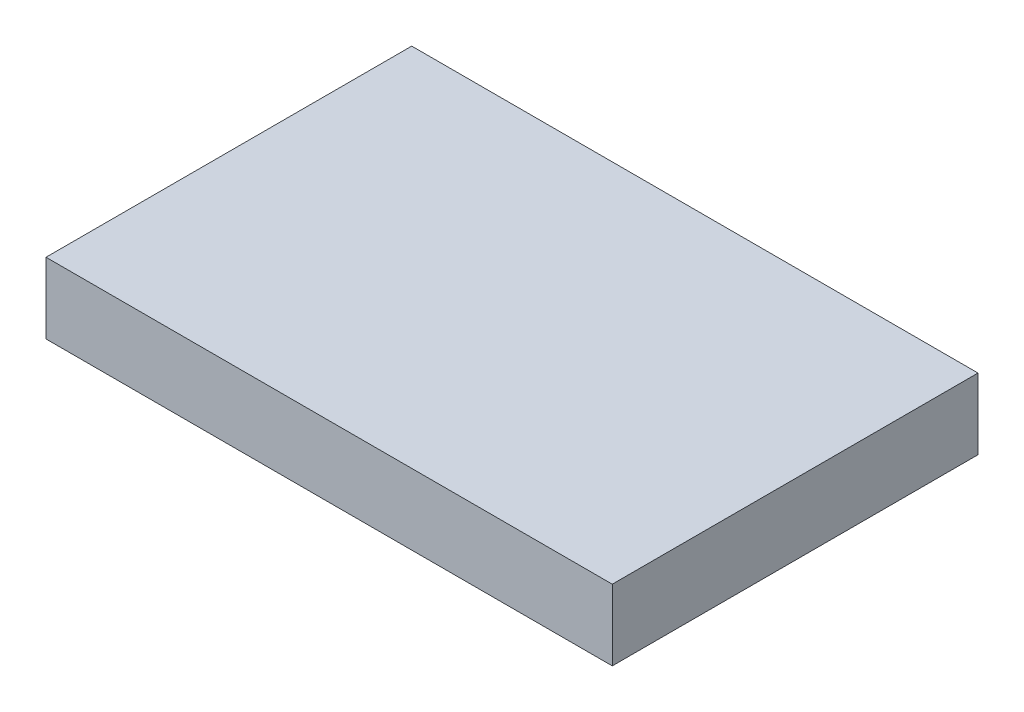
ISO-10303-21;
HEADER;
FILE_DESCRIPTION(('STEP AP214'),'2;1');
FILE_NAME('part.step','',(''),(''),'','','');
FILE_SCHEMA(('AUTOMOTIVE_DESIGN { 1 0 10303 214 1 1 1 1 }'));
ENDSEC;
DATA;
#1=APPLICATION_CONTEXT('core data for automotive mechanical design processes');
#2=APPLICATION_PROTOCOL_DEFINITION('international standard','automotive_design',2000,#1);
#3=PRODUCT_CONTEXT('',#1,'mechanical');
#4=PRODUCT('Part','Part','',(#3));
#5=PRODUCT_RELATED_PRODUCT_CATEGORY('part','',(#4));
#6=PRODUCT_DEFINITION_FORMATION('','',#4);
#7=PRODUCT_DEFINITION_CONTEXT('part definition',#1,'design');
#8=PRODUCT_DEFINITION('design','',#6,#7);
#9=PRODUCT_DEFINITION_SHAPE('','',#8);
#10=(LENGTH_UNIT() NAMED_UNIT(*) SI_UNIT(.MILLI.,.METRE.));
#11=(NAMED_UNIT(*) PLANE_ANGLE_UNIT() SI_UNIT($,.RADIAN.));
#12=(NAMED_UNIT(*) SI_UNIT($,.STERADIAN.) SOLID_ANGLE_UNIT());
#13=UNCERTAINTY_MEASURE_WITH_UNIT(LENGTH_MEASURE(1.E-05),#10,'distance_accuracy_value','');
#14=(GEOMETRIC_REPRESENTATION_CONTEXT(3) GLOBAL_UNCERTAINTY_ASSIGNED_CONTEXT((#13)) GLOBAL_UNIT_ASSIGNED_CONTEXT((#10,
#11,#12)) REPRESENTATION_CONTEXT('',''));
#15=CARTESIAN_POINT('',(0.,0.,0.));
#16=DIRECTION('',(0.,0.,1.));
#17=DIRECTION('',(1.,0.,0.));
#18=AXIS2_PLACEMENT_3D('',#15,#16,#17);
#19=CARTESIAN_POINT('',(24.,6.,15.5));
#20=DIRECTION('',(-1.,0.,0.));
#21=DIRECTION('',(0.,0.,1.));
#22=AXIS2_PLACEMENT_3D('',#19,#20,#21);
#23=PLANE('',#22);
#24=DIRECTION('',(0.,0.,-1.));
#25=VECTOR('',#24,1.);
#26=CARTESIAN_POINT('',(24.,0.,15.5));
#27=LINE('',#26,#25);
#28=CARTESIAN_POINT('',(24.,0.,15.5));
#29=VERTEX_POINT('',#28);
#30=CARTESIAN_POINT('',(24.,0.,-15.5));
#31=VERTEX_POINT('',#30);
#32=EDGE_CURVE('E96',#29,#31,#27,.T.);
#33=ORIENTED_EDGE('',*,*,#32,.T.);
#34=DIRECTION('',(0.,-1.,0.));
#35=VECTOR('',#34,1.);
#36=CARTESIAN_POINT('',(24.,6.,-15.5));
#37=LINE('',#36,#35);
#38=CARTESIAN_POINT('',(24.,6.,-15.5));
#39=VERTEX_POINT('',#38);
#40=EDGE_CURVE('E11',#39,#31,#37,.T.);
#41=ORIENTED_EDGE('',*,*,#40,.F.);
#42=DIRECTION('',(0.,0.,-1.));
#43=VECTOR('',#42,1.);
#44=CARTESIAN_POINT('',(24.,6.,15.5));
#45=LINE('',#44,#43);
#46=CARTESIAN_POINT('',(24.,6.,15.5));
#47=VERTEX_POINT('',#46);
#48=EDGE_CURVE('E84',#47,#39,#45,.T.);
#49=ORIENTED_EDGE('',*,*,#48,.F.);
#50=DIRECTION('',(0.,-1.,0.));
#51=VECTOR('',#50,1.);
#52=CARTESIAN_POINT('',(24.,6.,15.5));
#53=LINE('',#52,#51);
#54=EDGE_CURVE('E92',#47,#29,#53,.T.);
#55=ORIENTED_EDGE('',*,*,#54,.T.);
#56=EDGE_LOOP('',(#33,#41,#49,#55));
#57=FACE_BOUND('',#56,.T.);
#58=ADVANCED_FACE('F33',(#57),#23,.F.);
#59=CARTESIAN_POINT('',(-24.,6.,-15.5));
#60=DIRECTION('',(0.,0.,1.));
#61=DIRECTION('',(1.,0.,0.));
#62=AXIS2_PLACEMENT_3D('',#59,#60,#61);
#63=PLANE('',#62);
#64=DIRECTION('',(-1.,0.,0.));
#65=VECTOR('',#64,1.);
#66=CARTESIAN_POINT('',(-24.,0.,-15.5));
#67=LINE('',#66,#65);
#68=CARTESIAN_POINT('',(-24.,0.,-15.5));
#69=VERTEX_POINT('',#68);
#70=EDGE_CURVE('E88',#31,#69,#67,.T.);
#71=ORIENTED_EDGE('',*,*,#70,.T.);
#72=DIRECTION('',(0.,-1.,0.));
#73=VECTOR('',#72,1.);
#74=CARTESIAN_POINT('',(-24.,6.,-15.5));
#75=LINE('',#74,#73);
#76=CARTESIAN_POINT('',(-24.,6.,-15.5));
#77=VERTEX_POINT('',#76);
#78=EDGE_CURVE('E41',#77,#69,#75,.T.);
#79=ORIENTED_EDGE('',*,*,#78,.F.);
#80=DIRECTION('',(-1.,0.,0.));
#81=VECTOR('',#80,1.);
#82=CARTESIAN_POINT('',(-24.,6.,-15.5));
#83=LINE('',#82,#81);
#84=EDGE_CURVE('E79',#39,#77,#83,.T.);
#85=ORIENTED_EDGE('',*,*,#84,.F.);
#86=ORIENTED_EDGE('',*,*,#40,.T.);
#87=EDGE_LOOP('',(#71,#79,#85,#86));
#88=FACE_BOUND('',#87,.T.);
#89=ADVANCED_FACE('F87',(#88),#63,.F.);
#90=CARTESIAN_POINT('',(-24.,6.,15.5));
#91=DIRECTION('',(1.,0.,0.));
#92=DIRECTION('',(0.,0.,-1.));
#93=AXIS2_PLACEMENT_3D('',#90,#91,#92);
#94=PLANE('',#93);
#95=DIRECTION('',(0.,0.,1.));
#96=VECTOR('',#95,1.);
#97=CARTESIAN_POINT('',(-24.,0.,15.5));
#98=LINE('',#97,#96);
#99=CARTESIAN_POINT('',(-24.,0.,15.5));
#100=VERTEX_POINT('',#99);
#101=EDGE_CURVE('E66',#69,#100,#98,.T.);
#102=ORIENTED_EDGE('',*,*,#101,.T.);
#103=DIRECTION('',(0.,-1.,0.));
#104=VECTOR('',#103,1.);
#105=CARTESIAN_POINT('',(-24.,6.,15.5));
#106=LINE('',#105,#104);
#107=CARTESIAN_POINT('',(-24.,6.,15.5));
#108=VERTEX_POINT('',#107);
#109=EDGE_CURVE('E89',#108,#100,#106,.T.);
#110=ORIENTED_EDGE('',*,*,#109,.F.);
#111=DIRECTION('',(0.,0.,1.));
#112=VECTOR('',#111,1.);
#113=CARTESIAN_POINT('',(-24.,6.,15.5));
#114=LINE('',#113,#112);
#115=EDGE_CURVE('E82',#77,#108,#114,.T.);
#116=ORIENTED_EDGE('',*,*,#115,.F.);
#117=ORIENTED_EDGE('',*,*,#78,.T.);
#118=EDGE_LOOP('',(#102,#110,#116,#117));
#119=FACE_BOUND('',#118,.T.);
#120=ADVANCED_FACE('F90',(#119),#94,.F.);
#121=CARTESIAN_POINT('',(-24.,6.,15.5));
#122=DIRECTION('',(0.,0.,-1.));
#123=DIRECTION('',(-1.,0.,0.));
#124=AXIS2_PLACEMENT_3D('',#121,#122,#123);
#125=PLANE('',#124);
#126=DIRECTION('',(1.,0.,0.));
#127=VECTOR('',#126,1.);
#128=CARTESIAN_POINT('',(-24.,0.,15.5));
#129=LINE('',#128,#127);
#130=EDGE_CURVE('E72',#100,#29,#129,.T.);
#131=ORIENTED_EDGE('',*,*,#130,.T.);
#132=ORIENTED_EDGE('',*,*,#54,.F.);
#133=DIRECTION('',(1.,0.,0.));
#134=VECTOR('',#133,1.);
#135=CARTESIAN_POINT('',(-24.,6.,15.5));
#136=LINE('',#135,#134);
#137=EDGE_CURVE('E49',#108,#47,#136,.T.);
#138=ORIENTED_EDGE('',*,*,#137,.F.);
#139=ORIENTED_EDGE('',*,*,#109,.T.);
#140=EDGE_LOOP('',(#131,#132,#138,#139));
#141=FACE_BOUND('',#140,.T.);
#142=ADVANCED_FACE('F103',(#141),#125,.F.);
#143=CARTESIAN_POINT('',(0.,6.,0.));
#144=DIRECTION('',(0.,-1.,0.));
#145=DIRECTION('',(0.,0.,-1.));
#146=AXIS2_PLACEMENT_3D('',#143,#144,#145);
#147=PLANE('',#146);
#148=ORIENTED_EDGE('',*,*,#48,.T.);
#149=ORIENTED_EDGE('',*,*,#84,.T.);
#150=ORIENTED_EDGE('',*,*,#115,.T.);
#151=ORIENTED_EDGE('',*,*,#137,.T.);
#152=EDGE_LOOP('',(#148,#149,#150,#151));
#153=FACE_BOUND('',#152,.T.);
#154=ADVANCED_FACE('F80',(#153),#147,.F.);
#155=CARTESIAN_POINT('',(0.,0.,0.));
#156=DIRECTION('',(0.,-1.,0.));
#157=DIRECTION('',(0.,0.,-1.));
#158=AXIS2_PLACEMENT_3D('',#155,#156,#157);
#159=PLANE('',#158);
#160=ORIENTED_EDGE('',*,*,#32,.F.);
#161=ORIENTED_EDGE('',*,*,#130,.F.);
#162=ORIENTED_EDGE('',*,*,#101,.F.);
#163=ORIENTED_EDGE('',*,*,#70,.F.);
#164=EDGE_LOOP('',(#160,#161,#162,#163));
#165=FACE_BOUND('',#164,.T.);
#166=ADVANCED_FACE('F106',(#165),#159,.T.);
#167=CLOSED_SHELL('',(#58,#89,#120,#142,#154,#166));
#168=MANIFOLD_SOLID_BREP('B2',#167);
#169=ADVANCED_BREP_SHAPE_REPRESENTATION('',(#18,#168),#14);
#170=SHAPE_DEFINITION_REPRESENTATION(#9,#169);
ENDSEC;
END-ISO-10303-21;
